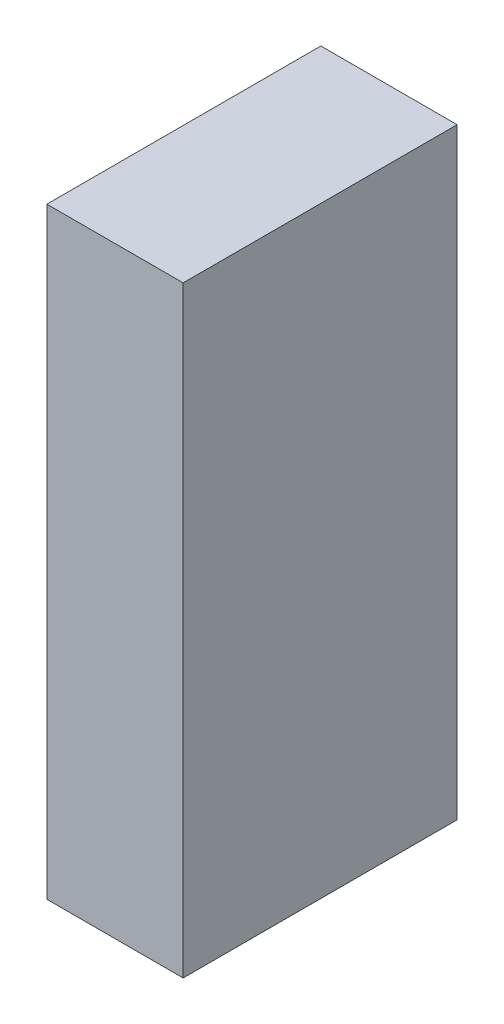
ISO-10303-21;
HEADER;
FILE_DESCRIPTION(('STEP AP214'),'2;1');
FILE_NAME('part.step','',(''),(''),'','','');
FILE_SCHEMA(('AUTOMOTIVE_DESIGN { 1 0 10303 214 1 1 1 1 }'));
ENDSEC;
DATA;
#1=APPLICATION_CONTEXT('core data for automotive mechanical design processes');
#2=APPLICATION_PROTOCOL_DEFINITION('international standard','automotive_design',2000,#1);
#3=PRODUCT_CONTEXT('',#1,'mechanical');
#4=PRODUCT('Part','Part','',(#3));
#5=PRODUCT_RELATED_PRODUCT_CATEGORY('part','',(#4));
#6=PRODUCT_DEFINITION_FORMATION('','',#4);
#7=PRODUCT_DEFINITION_CONTEXT('part definition',#1,'design');
#8=PRODUCT_DEFINITION('design','',#6,#7);
#9=PRODUCT_DEFINITION_SHAPE('','',#8);
#10=(LENGTH_UNIT() NAMED_UNIT(*) SI_UNIT(.MILLI.,.METRE.));
#11=(NAMED_UNIT(*) PLANE_ANGLE_UNIT() SI_UNIT($,.RADIAN.));
#12=(NAMED_UNIT(*) SI_UNIT($,.STERADIAN.) SOLID_ANGLE_UNIT());
#13=UNCERTAINTY_MEASURE_WITH_UNIT(LENGTH_MEASURE(1.E-05),#10,'distance_accuracy_value','');
#14=(GEOMETRIC_REPRESENTATION_CONTEXT(3) GLOBAL_UNCERTAINTY_ASSIGNED_CONTEXT((#13)) GLOBAL_UNIT_ASSIGNED_CONTEXT((#10,
#11,#12)) REPRESENTATION_CONTEXT('',''));
#15=CARTESIAN_POINT('',(0.,0.,0.));
#16=DIRECTION('',(0.,0.,1.));
#17=DIRECTION('',(1.,0.,0.));
#18=AXIS2_PLACEMENT_3D('',#15,#16,#17);
#19=CARTESIAN_POINT('',(0.0994918,0.43949112,0.));
#20=DIRECTION('',(1.,0.,0.));
#21=DIRECTION('',(0.,0.,-1.));
#22=AXIS2_PLACEMENT_3D('',#19,#20,#21);
#23=PLANE('',#22);
#24=DIRECTION('',(0.,0.,-1.));
#25=VECTOR('',#24,1.);
#26=CARTESIAN_POINT('',(0.0994918,-0.43949112,0.));
#27=LINE('',#26,#25);
#28=CARTESIAN_POINT('',(0.0994918,-0.43949112,0.));
#29=VERTEX_POINT('',#28);
#30=CARTESIAN_POINT('',(0.0994918,-0.43949112,0.4));
#31=VERTEX_POINT('',#30);
#32=EDGE_CURVE('E20',#29,#31,#27,.F.);
#33=ORIENTED_EDGE('',*,*,#32,.F.);
#34=DIRECTION('',(0.,1.,0.));
#35=VECTOR('',#34,1.);
#36=CARTESIAN_POINT('',(0.0994918,-0.43949112,0.));
#37=LINE('',#36,#35);
#38=CARTESIAN_POINT('',(0.0994918,0.43949112,0.));
#39=VERTEX_POINT('',#38);
#40=EDGE_CURVE('E80',#29,#39,#37,.T.);
#41=ORIENTED_EDGE('',*,*,#40,.T.);
#42=DIRECTION('',(0.,0.,1.));
#43=VECTOR('',#42,1.);
#44=CARTESIAN_POINT('',(0.0994918,0.43949112,0.));
#45=LINE('',#44,#43);
#46=CARTESIAN_POINT('',(0.0994918,0.43949112,0.4));
#47=VERTEX_POINT('',#46);
#48=EDGE_CURVE('E68',#47,#39,#45,.F.);
#49=ORIENTED_EDGE('',*,*,#48,.F.);
#50=DIRECTION('',(0.,1.,0.));
#51=VECTOR('',#50,1.);
#52=CARTESIAN_POINT('',(0.0994918,-0.43949112,0.4));
#53=LINE('',#52,#51);
#54=EDGE_CURVE('E56',#31,#47,#53,.T.);
#55=ORIENTED_EDGE('',*,*,#54,.F.);
#56=EDGE_LOOP('',(#33,#41,#49,#55));
#57=FACE_BOUND('',#56,.T.);
#58=ADVANCED_FACE('F17',(#57),#23,.T.);
#59=CARTESIAN_POINT('',(0.0994918,-0.43949112,0.));
#60=DIRECTION('',(0.,-1.,0.));
#61=DIRECTION('',(0.,0.,-1.));
#62=AXIS2_PLACEMENT_3D('',#59,#60,#61);
#63=PLANE('',#62);
#64=DIRECTION('',(0.,0.,1.));
#65=VECTOR('',#64,1.);
#66=CARTESIAN_POINT('',(-0.0994918,-0.43949112,0.));
#67=LINE('',#66,#65);
#68=CARTESIAN_POINT('',(-0.0994918,-0.43949112,0.));
#69=VERTEX_POINT('',#68);
#70=CARTESIAN_POINT('',(-0.0994918,-0.43949112,0.4));
#71=VERTEX_POINT('',#70);
#72=EDGE_CURVE('E83',#69,#71,#67,.T.);
#73=ORIENTED_EDGE('',*,*,#72,.F.);
#74=DIRECTION('',(1.,0.,0.));
#75=VECTOR('',#74,1.);
#76=CARTESIAN_POINT('',(-0.0994918,-0.43949112,0.));
#77=LINE('',#76,#75);
#78=EDGE_CURVE('E65',#69,#29,#77,.T.);
#79=ORIENTED_EDGE('',*,*,#78,.T.);
#80=ORIENTED_EDGE('',*,*,#32,.T.);
#81=DIRECTION('',(1.,0.,0.));
#82=VECTOR('',#81,1.);
#83=CARTESIAN_POINT('',(-0.0994918,-0.43949112,0.4));
#84=LINE('',#83,#82);
#85=EDGE_CURVE('E62',#71,#31,#84,.T.);
#86=ORIENTED_EDGE('',*,*,#85,.F.);
#87=EDGE_LOOP('',(#73,#79,#80,#86));
#88=FACE_BOUND('',#87,.T.);
#89=ADVANCED_FACE('F61',(#88),#63,.T.);
#90=CARTESIAN_POINT('',(-0.0994918,-0.43949112,0.4));
#91=DIRECTION('',(0.,0.,1.));
#92=DIRECTION('',(1.,0.,0.));
#93=AXIS2_PLACEMENT_3D('',#90,#91,#92);
#94=PLANE('',#93);
#95=ORIENTED_EDGE('',*,*,#54,.T.);
#96=DIRECTION('',(1.,0.,0.));
#97=VECTOR('',#96,1.);
#98=CARTESIAN_POINT('',(-0.0994918,0.43949112,0.4));
#99=LINE('',#98,#97);
#100=CARTESIAN_POINT('',(-0.0994918,0.43949112,0.4));
#101=VERTEX_POINT('',#100);
#102=EDGE_CURVE('E70',#101,#47,#99,.T.);
#103=ORIENTED_EDGE('',*,*,#102,.F.);
#104=DIRECTION('',(0.,1.,0.));
#105=VECTOR('',#104,1.);
#106=CARTESIAN_POINT('',(-0.0994918,-0.43949112,0.4));
#107=LINE('',#106,#105);
#108=EDGE_CURVE('E74',#71,#101,#107,.T.);
#109=ORIENTED_EDGE('',*,*,#108,.F.);
#110=ORIENTED_EDGE('',*,*,#85,.T.);
#111=EDGE_LOOP('',(#95,#103,#109,#110));
#112=FACE_BOUND('',#111,.T.);
#113=ADVANCED_FACE('F72',(#112),#94,.T.);
#114=CARTESIAN_POINT('',(-0.0994918,0.43949112,0.));
#115=DIRECTION('',(0.,1.,0.));
#116=DIRECTION('',(0.,0.,1.));
#117=AXIS2_PLACEMENT_3D('',#114,#115,#116);
#118=PLANE('',#117);
#119=ORIENTED_EDGE('',*,*,#48,.T.);
#120=DIRECTION('',(1.,0.,0.));
#121=VECTOR('',#120,1.);
#122=CARTESIAN_POINT('',(-0.0994918,0.43949112,0.));
#123=LINE('',#122,#121);
#124=CARTESIAN_POINT('',(-0.0994918,0.43949112,0.));
#125=VERTEX_POINT('',#124);
#126=EDGE_CURVE('E35',#39,#125,#123,.F.);
#127=ORIENTED_EDGE('',*,*,#126,.T.);
#128=DIRECTION('',(0.,0.,1.));
#129=VECTOR('',#128,1.);
#130=CARTESIAN_POINT('',(-0.0994918,0.43949112,0.));
#131=LINE('',#130,#129);
#132=EDGE_CURVE('E26',#101,#125,#131,.F.);
#133=ORIENTED_EDGE('',*,*,#132,.F.);
#134=ORIENTED_EDGE('',*,*,#102,.T.);
#135=EDGE_LOOP('',(#119,#127,#133,#134));
#136=FACE_BOUND('',#135,.T.);
#137=ADVANCED_FACE('F89',(#136),#118,.T.);
#138=CARTESIAN_POINT('',(-0.0994918,-0.43949112,0.));
#139=DIRECTION('',(0.,0.,1.));
#140=DIRECTION('',(1.,0.,0.));
#141=AXIS2_PLACEMENT_3D('',#138,#139,#140);
#142=PLANE('',#141);
#143=ORIENTED_EDGE('',*,*,#126,.F.);
#144=ORIENTED_EDGE('',*,*,#40,.F.);
#145=ORIENTED_EDGE('',*,*,#78,.F.);
#146=DIRECTION('',(0.,1.,0.));
#147=VECTOR('',#146,1.);
#148=CARTESIAN_POINT('',(-0.0994918,-0.43949112,0.));
#149=LINE('',#148,#147);
#150=EDGE_CURVE('E11',#125,#69,#149,.F.);
#151=ORIENTED_EDGE('',*,*,#150,.F.);
#152=EDGE_LOOP('',(#143,#144,#145,#151));
#153=FACE_BOUND('',#152,.T.);
#154=ADVANCED_FACE('F91',(#153),#142,.F.);
#155=CARTESIAN_POINT('',(-0.0994918,-0.43949112,0.));
#156=DIRECTION('',(-1.,0.,0.));
#157=DIRECTION('',(0.,0.,1.));
#158=AXIS2_PLACEMENT_3D('',#155,#156,#157);
#159=PLANE('',#158);
#160=ORIENTED_EDGE('',*,*,#132,.T.);
#161=ORIENTED_EDGE('',*,*,#150,.T.);
#162=ORIENTED_EDGE('',*,*,#72,.T.);
#163=ORIENTED_EDGE('',*,*,#108,.T.);
#164=EDGE_LOOP('',(#160,#161,#162,#163));
#165=FACE_BOUND('',#164,.T.);
#166=ADVANCED_FACE('F88',(#165),#159,.T.);
#167=CLOSED_SHELL('',(#58,#89,#113,#137,#154,#166));
#168=MANIFOLD_SOLID_BREP('B1',#167);
#169=ADVANCED_BREP_SHAPE_REPRESENTATION('',(#18,#168),#14);
#170=SHAPE_DEFINITION_REPRESENTATION(#9,#169);
ENDSEC;
END-ISO-10303-21;
